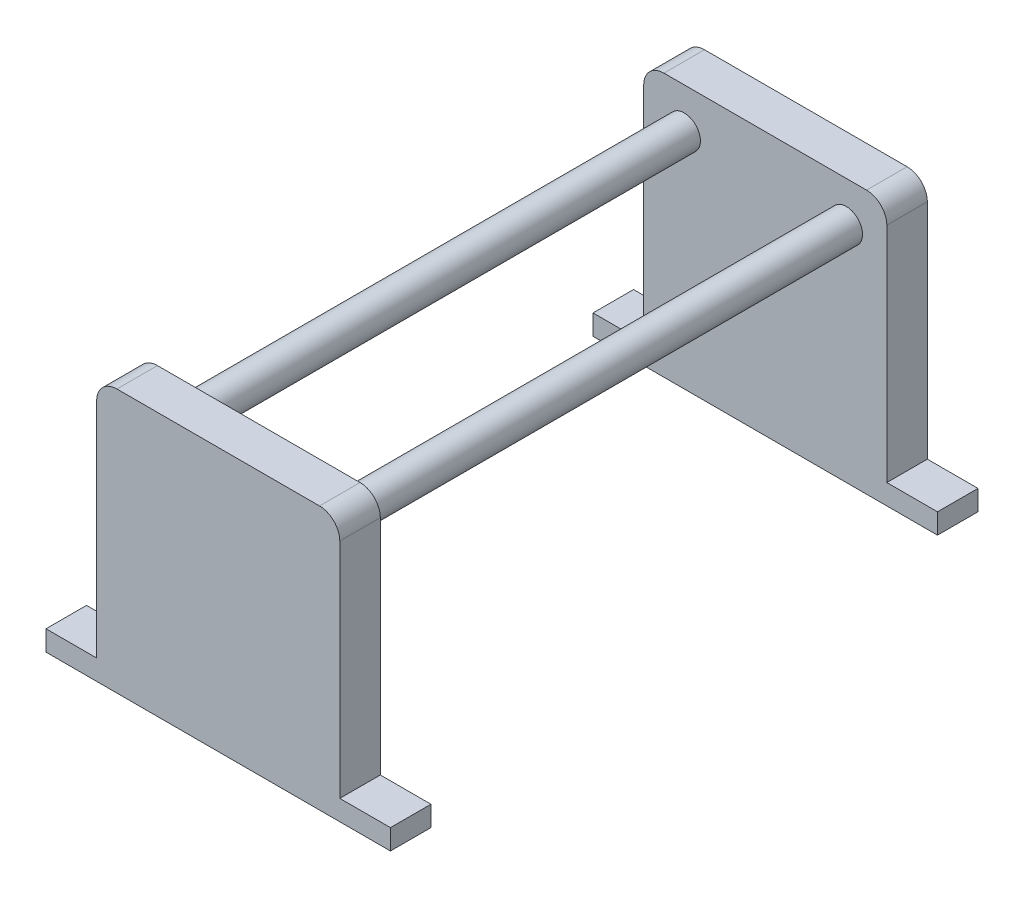
ISO-10303-21;
HEADER;
FILE_DESCRIPTION(('STEP AP214'),'2;1');
FILE_NAME('part.step','',(''),(''),'','','');
FILE_SCHEMA(('AUTOMOTIVE_DESIGN { 1 0 10303 214 1 1 1 1 }'));
ENDSEC;
DATA;
#1=APPLICATION_CONTEXT('core data for automotive mechanical design processes');
#2=APPLICATION_PROTOCOL_DEFINITION('international standard','automotive_design',2000,#1);
#3=PRODUCT_CONTEXT('',#1,'mechanical');
#4=PRODUCT('Part','Part','',(#3));
#5=PRODUCT_RELATED_PRODUCT_CATEGORY('part','',(#4));
#6=PRODUCT_DEFINITION_FORMATION('','',#4);
#7=PRODUCT_DEFINITION_CONTEXT('part definition',#1,'design');
#8=PRODUCT_DEFINITION('design','',#6,#7);
#9=PRODUCT_DEFINITION_SHAPE('','',#8);
#10=(LENGTH_UNIT() NAMED_UNIT(*) SI_UNIT(.MILLI.,.METRE.));
#11=(NAMED_UNIT(*) PLANE_ANGLE_UNIT() SI_UNIT($,.RADIAN.));
#12=(NAMED_UNIT(*) SI_UNIT($,.STERADIAN.) SOLID_ANGLE_UNIT());
#13=UNCERTAINTY_MEASURE_WITH_UNIT(LENGTH_MEASURE(1.E-05),#10,'distance_accuracy_value','');
#14=(GEOMETRIC_REPRESENTATION_CONTEXT(3) GLOBAL_UNCERTAINTY_ASSIGNED_CONTEXT((#13)) GLOBAL_UNIT_ASSIGNED_CONTEXT((#10,
#11,#12)) REPRESENTATION_CONTEXT('',''));
#15=CARTESIAN_POINT('',(0.,0.,0.));
#16=DIRECTION('',(0.,0.,1.));
#17=DIRECTION('',(1.,0.,0.));
#18=AXIS2_PLACEMENT_3D('',#15,#16,#17);
#19=CARTESIAN_POINT('',(0.,30.,10.));
#20=DIRECTION('',(0.,-1.,0.));
#21=DIRECTION('',(0.,0.,-1.));
#22=AXIS2_PLACEMENT_3D('',#19,#20,#21);
#23=PLANE('',#22);
#24=DIRECTION('',(-1.,0.,0.));
#25=VECTOR('',#24,1.);
#26=CARTESIAN_POINT('',(0.,30.,10.));
#27=LINE('',#26,#25);
#28=CARTESIAN_POINT('',(25.,30.,10.));
#29=VERTEX_POINT('',#28);
#30=CARTESIAN_POINT('',(-25.,30.,10.));
#31=VERTEX_POINT('',#30);
#32=EDGE_CURVE('E244',#29,#31,#27,.T.);
#33=ORIENTED_EDGE('',*,*,#32,.F.);
#34=DIRECTION('',(0.,0.,-1.));
#35=VECTOR('',#34,1.);
#36=CARTESIAN_POINT('',(25.,30.,0.));
#37=LINE('',#36,#35);
#38=CARTESIAN_POINT('',(25.,30.,0.));
#39=VERTEX_POINT('',#38);
#40=EDGE_CURVE('E297',#29,#39,#37,.T.);
#41=ORIENTED_EDGE('',*,*,#40,.T.);
#42=DIRECTION('',(-1.,0.,0.));
#43=VECTOR('',#42,1.);
#44=CARTESIAN_POINT('',(0.,30.,0.));
#45=LINE('',#44,#43);
#46=CARTESIAN_POINT('',(-25.,30.,0.));
#47=VERTEX_POINT('',#46);
#48=EDGE_CURVE('E243',#39,#47,#45,.T.);
#49=ORIENTED_EDGE('',*,*,#48,.T.);
#50=DIRECTION('',(0.,0.,-1.));
#51=VECTOR('',#50,1.);
#52=CARTESIAN_POINT('',(-25.,30.,10.));
#53=LINE('',#52,#51);
#54=EDGE_CURVE('E295',#47,#31,#53,.F.);
#55=ORIENTED_EDGE('',*,*,#54,.T.);
#56=EDGE_LOOP('',(#33,#41,#49,#55));
#57=FACE_BOUND('',#56,.T.);
#58=ADVANCED_FACE('F34',(#57),#23,.F.);
#59=CARTESIAN_POINT('',(-30.,0.,10.));
#60=DIRECTION('',(1.,0.,0.));
#61=DIRECTION('',(0.,0.,-1.));
#62=AXIS2_PLACEMENT_3D('',#59,#60,#61);
#63=PLANE('',#62);
#64=DIRECTION('',(0.,-1.,0.));
#65=VECTOR('',#64,1.);
#66=CARTESIAN_POINT('',(-30.,0.,10.));
#67=LINE('',#66,#65);
#68=CARTESIAN_POINT('',(-30.,25.,10.));
#69=VERTEX_POINT('',#68);
#70=CARTESIAN_POINT('',(-30.,-30.,10.));
#71=VERTEX_POINT('',#70);
#72=EDGE_CURVE('E247',#69,#71,#67,.T.);
#73=ORIENTED_EDGE('',*,*,#72,.F.);
#74=DIRECTION('',(0.,0.,-1.));
#75=VECTOR('',#74,1.);
#76=CARTESIAN_POINT('',(-30.,25.,10.));
#77=LINE('',#76,#75);
#78=CARTESIAN_POINT('',(-30.,25.,0.));
#79=VERTEX_POINT('',#78);
#80=EDGE_CURVE('E310',#69,#79,#77,.T.);
#81=ORIENTED_EDGE('',*,*,#80,.T.);
#82=DIRECTION('',(0.,-1.,0.));
#83=VECTOR('',#82,1.);
#84=CARTESIAN_POINT('',(-30.,0.,0.));
#85=LINE('',#84,#83);
#86=CARTESIAN_POINT('',(-30.,-30.,0.));
#87=VERTEX_POINT('',#86);
#88=EDGE_CURVE('E266',#79,#87,#85,.T.);
#89=ORIENTED_EDGE('',*,*,#88,.T.);
#90=DIRECTION('',(0.,0.,-1.));
#91=VECTOR('',#90,1.);
#92=CARTESIAN_POINT('',(-30.,-30.,10.));
#93=LINE('',#92,#91);
#94=EDGE_CURVE('E292',#71,#87,#93,.T.);
#95=ORIENTED_EDGE('',*,*,#94,.F.);
#96=EDGE_LOOP('',(#73,#81,#89,#95));
#97=FACE_BOUND('',#96,.T.);
#98=ADVANCED_FACE('F362',(#97),#63,.F.);
#99=CARTESIAN_POINT('',(0.,-30.,10.));
#100=DIRECTION('',(0.,1.,0.));
#101=DIRECTION('',(-1.,0.,0.));
#102=AXIS2_PLACEMENT_3D('',#99,#100,#101);
#103=PLANE('',#102);
#104=DIRECTION('',(1.,0.,0.));
#105=VECTOR('',#104,1.);
#106=CARTESIAN_POINT('',(0.,-30.,0.));
#107=LINE('',#106,#105);
#108=CARTESIAN_POINT('',(-42.5,-30.,0.));
#109=VERTEX_POINT('',#108);
#110=EDGE_CURVE('E268',#109,#87,#107,.T.);
#111=ORIENTED_EDGE('',*,*,#110,.F.);
#112=DIRECTION('',(0.,0.,-1.));
#113=VECTOR('',#112,1.);
#114=CARTESIAN_POINT('',(-42.5,-30.,10.));
#115=LINE('',#114,#113);
#116=CARTESIAN_POINT('',(-42.5,-30.,10.));
#117=VERTEX_POINT('',#116);
#118=EDGE_CURVE('E290',#117,#109,#115,.T.);
#119=ORIENTED_EDGE('',*,*,#118,.F.);
#120=DIRECTION('',(1.,0.,0.));
#121=VECTOR('',#120,1.);
#122=CARTESIAN_POINT('',(0.,-30.,10.));
#123=LINE('',#122,#121);
#124=EDGE_CURVE('E250',#117,#71,#123,.T.);
#125=ORIENTED_EDGE('',*,*,#124,.T.);
#126=ORIENTED_EDGE('',*,*,#94,.T.);
#127=EDGE_LOOP('',(#111,#119,#125,#126));
#128=FACE_BOUND('',#127,.T.);
#129=ADVANCED_FACE('F368',(#128),#103,.T.);
#130=CARTESIAN_POINT('',(-42.5,0.,10.));
#131=DIRECTION('',(1.,0.,0.));
#132=DIRECTION('',(0.,0.,-1.));
#133=AXIS2_PLACEMENT_3D('',#130,#131,#132);
#134=PLANE('',#133);
#135=DIRECTION('',(0.,-1.,0.));
#136=VECTOR('',#135,1.);
#137=CARTESIAN_POINT('',(-42.5,0.,0.));
#138=LINE('',#137,#136);
#139=CARTESIAN_POINT('',(-42.5,-35.,0.));
#140=VERTEX_POINT('',#139);
#141=EDGE_CURVE('E271',#109,#140,#138,.T.);
#142=ORIENTED_EDGE('',*,*,#141,.T.);
#143=DIRECTION('',(0.,0.,-1.));
#144=VECTOR('',#143,1.);
#145=CARTESIAN_POINT('',(-42.5,-35.,10.));
#146=LINE('',#145,#144);
#147=CARTESIAN_POINT('',(-42.5,-35.,10.));
#148=VERTEX_POINT('',#147);
#149=EDGE_CURVE('E287',#148,#140,#146,.T.);
#150=ORIENTED_EDGE('',*,*,#149,.F.);
#151=DIRECTION('',(0.,-1.,0.));
#152=VECTOR('',#151,1.);
#153=CARTESIAN_POINT('',(-42.5,0.,10.));
#154=LINE('',#153,#152);
#155=EDGE_CURVE('E253',#117,#148,#154,.T.);
#156=ORIENTED_EDGE('',*,*,#155,.F.);
#157=ORIENTED_EDGE('',*,*,#118,.T.);
#158=EDGE_LOOP('',(#142,#150,#156,#157));
#159=FACE_BOUND('',#158,.T.);
#160=ADVANCED_FACE('F407',(#159),#134,.F.);
#161=CARTESIAN_POINT('',(0.,-35.,10.));
#162=DIRECTION('',(0.,1.,0.));
#163=DIRECTION('',(0.,0.,1.));
#164=AXIS2_PLACEMENT_3D('',#161,#162,#163);
#165=PLANE('',#164);
#166=DIRECTION('',(1.,0.,0.));
#167=VECTOR('',#166,1.);
#168=CARTESIAN_POINT('',(0.,-35.,0.));
#169=LINE('',#168,#167);
#170=CARTESIAN_POINT('',(42.5,-35.,0.));
#171=VERTEX_POINT('',#170);
#172=EDGE_CURVE('E274',#140,#171,#169,.T.);
#173=ORIENTED_EDGE('',*,*,#172,.T.);
#174=DIRECTION('',(0.,0.,-1.));
#175=VECTOR('',#174,1.);
#176=CARTESIAN_POINT('',(42.5,-35.,10.));
#177=LINE('',#176,#175);
#178=CARTESIAN_POINT('',(42.5,-35.,10.));
#179=VERTEX_POINT('',#178);
#180=EDGE_CURVE('E285',#179,#171,#177,.T.);
#181=ORIENTED_EDGE('',*,*,#180,.F.);
#182=DIRECTION('',(1.,0.,0.));
#183=VECTOR('',#182,1.);
#184=CARTESIAN_POINT('',(0.,-35.,10.));
#185=LINE('',#184,#183);
#186=EDGE_CURVE('E256',#148,#179,#185,.T.);
#187=ORIENTED_EDGE('',*,*,#186,.F.);
#188=ORIENTED_EDGE('',*,*,#149,.T.);
#189=EDGE_LOOP('',(#173,#181,#187,#188));
#190=FACE_BOUND('',#189,.T.);
#191=ADVANCED_FACE('F411',(#190),#165,.F.);
#192=CARTESIAN_POINT('',(42.5,0.,10.));
#193=DIRECTION('',(1.,0.,0.));
#194=DIRECTION('',(0.,1.,0.));
#195=AXIS2_PLACEMENT_3D('',#192,#193,#194);
#196=PLANE('',#195);
#197=DIRECTION('',(0.,-1.,0.));
#198=VECTOR('',#197,1.);
#199=CARTESIAN_POINT('',(42.5,0.,0.));
#200=LINE('',#199,#198);
#201=CARTESIAN_POINT('',(42.5,-30.,0.));
#202=VERTEX_POINT('',#201);
#203=EDGE_CURVE('E277',#202,#171,#200,.T.);
#204=ORIENTED_EDGE('',*,*,#203,.F.);
#205=DIRECTION('',(0.,0.,-1.));
#206=VECTOR('',#205,1.);
#207=CARTESIAN_POINT('',(42.5,-30.,10.));
#208=LINE('',#207,#206);
#209=CARTESIAN_POINT('',(42.5,-30.,10.));
#210=VERTEX_POINT('',#209);
#211=EDGE_CURVE('E283',#210,#202,#208,.T.);
#212=ORIENTED_EDGE('',*,*,#211,.F.);
#213=DIRECTION('',(0.,-1.,0.));
#214=VECTOR('',#213,1.);
#215=CARTESIAN_POINT('',(42.5,0.,10.));
#216=LINE('',#215,#214);
#217=EDGE_CURVE('E258',#210,#179,#216,.T.);
#218=ORIENTED_EDGE('',*,*,#217,.T.);
#219=ORIENTED_EDGE('',*,*,#180,.T.);
#220=EDGE_LOOP('',(#204,#212,#218,#219));
#221=FACE_BOUND('',#220,.T.);
#222=ADVANCED_FACE('F414',(#221),#196,.T.);
#223=CARTESIAN_POINT('',(30.,-30.,0.));
#224=VERTEX_POINT('',#223);
#225=EDGE_CURVE('E272',#224,#202,#107,.T.);
#226=ORIENTED_EDGE('',*,*,#225,.F.);
#227=DIRECTION('',(0.,0.,-1.));
#228=VECTOR('',#227,1.);
#229=CARTESIAN_POINT('',(30.,-30.,10.));
#230=LINE('',#229,#228);
#231=CARTESIAN_POINT('',(30.,-30.,10.));
#232=VERTEX_POINT('',#231);
#233=EDGE_CURVE('E263',#232,#224,#230,.T.);
#234=ORIENTED_EDGE('',*,*,#233,.F.);
#235=EDGE_CURVE('E254',#232,#210,#123,.T.);
#236=ORIENTED_EDGE('',*,*,#235,.T.);
#237=ORIENTED_EDGE('',*,*,#211,.T.);
#238=EDGE_LOOP('',(#226,#234,#236,#237));
#239=FACE_BOUND('',#238,.T.);
#240=ADVANCED_FACE('F420',(#239),#103,.T.);
#241=CARTESIAN_POINT('',(30.,0.,10.));
#242=DIRECTION('',(1.,0.,0.));
#243=DIRECTION('',(0.,0.,-1.));
#244=AXIS2_PLACEMENT_3D('',#241,#242,#243);
#245=PLANE('',#244);
#246=DIRECTION('',(0.,-1.,0.));
#247=VECTOR('',#246,1.);
#248=CARTESIAN_POINT('',(30.,0.,0.));
#249=LINE('',#248,#247);
#250=CARTESIAN_POINT('',(30.,25.,0.));
#251=VERTEX_POINT('',#250);
#252=EDGE_CURVE('E248',#251,#224,#249,.T.);
#253=ORIENTED_EDGE('',*,*,#252,.F.);
#254=DIRECTION('',(0.,0.,-1.));
#255=VECTOR('',#254,1.);
#256=CARTESIAN_POINT('',(30.,25.,10.));
#257=LINE('',#256,#255);
#258=CARTESIAN_POINT('',(30.,25.,10.));
#259=VERTEX_POINT('',#258);
#260=EDGE_CURVE('E304',#251,#259,#257,.F.);
#261=ORIENTED_EDGE('',*,*,#260,.T.);
#262=DIRECTION('',(0.,-1.,0.));
#263=VECTOR('',#262,1.);
#264=CARTESIAN_POINT('',(30.,0.,10.));
#265=LINE('',#264,#263);
#266=EDGE_CURVE('E261',#259,#232,#265,.T.);
#267=ORIENTED_EDGE('',*,*,#266,.T.);
#268=ORIENTED_EDGE('',*,*,#233,.T.);
#269=EDGE_LOOP('',(#253,#261,#267,#268));
#270=FACE_BOUND('',#269,.T.);
#271=ADVANCED_FACE('F424',(#270),#245,.T.);
#272=CARTESIAN_POINT('',(0.,0.,10.));
#273=DIRECTION('',(0.,0.,1.));
#274=DIRECTION('',(1.,0.,0.));
#275=AXIS2_PLACEMENT_3D('',#272,#273,#274);
#276=PLANE('',#275);
#277=ORIENTED_EDGE('',*,*,#266,.F.);
#278=CARTESIAN_POINT('',(25.,25.,10.));
#279=DIRECTION('',(0.,0.,1.));
#280=DIRECTION('',(1.,0.,0.));
#281=AXIS2_PLACEMENT_3D('',#278,#279,#280);
#282=CIRCLE('',#281,5.);
#283=EDGE_CURVE('E308',#259,#29,#282,.T.);
#284=ORIENTED_EDGE('',*,*,#283,.T.);
#285=ORIENTED_EDGE('',*,*,#32,.T.);
#286=CARTESIAN_POINT('',(-25.,25.,10.));
#287=DIRECTION('',(0.,0.,1.));
#288=DIRECTION('',(1.,0.,0.));
#289=AXIS2_PLACEMENT_3D('',#286,#287,#288);
#290=CIRCLE('',#289,5.);
#291=EDGE_CURVE('E306',#31,#69,#290,.T.);
#292=ORIENTED_EDGE('',*,*,#291,.T.);
#293=ORIENTED_EDGE('',*,*,#72,.T.);
#294=ORIENTED_EDGE('',*,*,#124,.F.);
#295=ORIENTED_EDGE('',*,*,#155,.T.);
#296=ORIENTED_EDGE('',*,*,#186,.T.);
#297=ORIENTED_EDGE('',*,*,#217,.F.);
#298=ORIENTED_EDGE('',*,*,#235,.F.);
#299=EDGE_LOOP('',(#277,#284,#285,#292,#293,#294,#295,#296,#297,#298));
#300=FACE_BOUND('',#299,.T.);
#301=ADVANCED_FACE('F395',(#300),#276,.T.);
#302=CARTESIAN_POINT('',(0.,0.,0.));
#303=DIRECTION('',(0.,0.,1.));
#304=DIRECTION('',(1.,0.,0.));
#305=AXIS2_PLACEMENT_3D('',#302,#303,#304);
#306=PLANE('',#305);
#307=CARTESIAN_POINT('',(-20.,20.,0.));
#308=DIRECTION('',(0.,0.,1.));
#309=DIRECTION('',(1.,0.,0.));
#310=AXIS2_PLACEMENT_3D('',#307,#308,#309);
#311=CIRCLE('',#310,4.);
#312=CARTESIAN_POINT('',(-16.,20.,0.));
#313=VERTEX_POINT('',#312);
#314=EDGE_CURVE('E316',#313,#313,#311,.F.);
#315=ORIENTED_EDGE('',*,*,#314,.F.);
#316=EDGE_LOOP('',(#315));
#317=FACE_BOUND('',#316,.T.);
#318=CARTESIAN_POINT('',(20.,20.,0.));
#319=DIRECTION('',(0.,0.,1.));
#320=DIRECTION('',(1.,0.,0.));
#321=AXIS2_PLACEMENT_3D('',#318,#319,#320);
#322=CIRCLE('',#321,4.);
#323=CARTESIAN_POINT('',(24.,20.,0.));
#324=VERTEX_POINT('',#323);
#325=EDGE_CURVE('E313',#324,#324,#322,.F.);
#326=ORIENTED_EDGE('',*,*,#325,.F.);
#327=EDGE_LOOP('',(#326));
#328=FACE_BOUND('',#327,.T.);
#329=ORIENTED_EDGE('',*,*,#48,.F.);
#330=CARTESIAN_POINT('',(25.,25.,0.));
#331=DIRECTION('',(0.,0.,1.));
#332=DIRECTION('',(1.,0.,0.));
#333=AXIS2_PLACEMENT_3D('',#330,#331,#332);
#334=CIRCLE('',#333,5.);
#335=EDGE_CURVE('E302',#39,#251,#334,.F.);
#336=ORIENTED_EDGE('',*,*,#335,.T.);
#337=ORIENTED_EDGE('',*,*,#252,.T.);
#338=ORIENTED_EDGE('',*,*,#225,.T.);
#339=ORIENTED_EDGE('',*,*,#203,.T.);
#340=ORIENTED_EDGE('',*,*,#172,.F.);
#341=ORIENTED_EDGE('',*,*,#141,.F.);
#342=ORIENTED_EDGE('',*,*,#110,.T.);
#343=ORIENTED_EDGE('',*,*,#88,.F.);
#344=CARTESIAN_POINT('',(-25.,25.,0.));
#345=DIRECTION('',(0.,0.,1.));
#346=DIRECTION('',(1.,0.,0.));
#347=AXIS2_PLACEMENT_3D('',#344,#345,#346);
#348=CIRCLE('',#347,5.);
#349=EDGE_CURVE('E300',#79,#47,#348,.F.);
#350=ORIENTED_EDGE('',*,*,#349,.T.);
#351=EDGE_LOOP('',(#329,#336,#337,#338,#339,#340,#341,#342,#343,#350));
#352=FACE_BOUND('',#351,.T.);
#353=ADVANCED_FACE('F378',(#317,#328,#352),#306,.F.);
#354=CARTESIAN_POINT('',(25.,25.,10.));
#355=DIRECTION('',(0.,0.,1.));
#356=DIRECTION('',(1.,0.,0.));
#357=AXIS2_PLACEMENT_3D('',#354,#355,#356);
#358=CYLINDRICAL_SURFACE('',#357,5.);
#359=ORIENTED_EDGE('',*,*,#283,.F.);
#360=ORIENTED_EDGE('',*,*,#260,.F.);
#361=ORIENTED_EDGE('',*,*,#335,.F.);
#362=ORIENTED_EDGE('',*,*,#40,.F.);
#363=EDGE_LOOP('',(#359,#360,#361,#362));
#364=FACE_BOUND('',#363,.T.);
#365=ADVANCED_FACE('F374',(#364),#358,.T.);
#366=CARTESIAN_POINT('',(-25.,25.,10.));
#367=DIRECTION('',(0.,0.,-1.));
#368=DIRECTION('',(-1.,0.,0.));
#369=AXIS2_PLACEMENT_3D('',#366,#367,#368);
#370=CYLINDRICAL_SURFACE('',#369,5.);
#371=ORIENTED_EDGE('',*,*,#291,.F.);
#372=ORIENTED_EDGE('',*,*,#54,.F.);
#373=ORIENTED_EDGE('',*,*,#349,.F.);
#374=ORIENTED_EDGE('',*,*,#80,.F.);
#375=EDGE_LOOP('',(#371,#372,#373,#374));
#376=FACE_BOUND('',#375,.T.);
#377=ADVANCED_FACE('F377',(#376),#370,.T.);
#378=CARTESIAN_POINT('',(20.,20.,-125.));
#379=DIRECTION('',(0.,0.,1.));
#380=DIRECTION('',(1.,0.,0.));
#381=AXIS2_PLACEMENT_3D('',#378,#379,#380);
#382=CYLINDRICAL_SURFACE('',#381,4.);
#383=CARTESIAN_POINT('',(20.,20.,-125.));
#384=DIRECTION('',(0.,0.,-1.));
#385=DIRECTION('',(-1.,0.,0.));
#386=AXIS2_PLACEMENT_3D('',#383,#384,#385);
#387=CIRCLE('',#386,4.);
#388=CARTESIAN_POINT('',(16.,20.,-125.));
#389=VERTEX_POINT('',#388);
#390=EDGE_CURVE('E240',#389,#389,#387,.T.);
#391=ORIENTED_EDGE('',*,*,#390,.F.);
#392=EDGE_LOOP('',(#391));
#393=FACE_BOUND('',#392,.T.);
#394=ORIENTED_EDGE('',*,*,#325,.T.);
#395=EDGE_LOOP('',(#394));
#396=FACE_BOUND('',#395,.T.);
#397=ADVANCED_FACE('F381',(#393,#396),#382,.T.);
#398=CARTESIAN_POINT('',(-20.,20.,-125.));
#399=DIRECTION('',(0.,0.,1.));
#400=DIRECTION('',(1.,0.,0.));
#401=AXIS2_PLACEMENT_3D('',#398,#399,#400);
#402=CYLINDRICAL_SURFACE('',#401,4.);
#403=CARTESIAN_POINT('',(-20.,20.,-125.));
#404=DIRECTION('',(0.,0.,-1.));
#405=DIRECTION('',(1.,0.,0.));
#406=AXIS2_PLACEMENT_3D('',#403,#404,#405);
#407=CIRCLE('',#406,4.);
#408=CARTESIAN_POINT('',(-16.,20.,-125.));
#409=VERTEX_POINT('',#408);
#410=EDGE_CURVE('E188',#409,#409,#407,.T.);
#411=ORIENTED_EDGE('',*,*,#410,.F.);
#412=EDGE_LOOP('',(#411));
#413=FACE_BOUND('',#412,.T.);
#414=ORIENTED_EDGE('',*,*,#314,.T.);
#415=EDGE_LOOP('',(#414));
#416=FACE_BOUND('',#415,.T.);
#417=ADVANCED_FACE('F386',(#413,#416),#402,.T.);
#418=CARTESIAN_POINT('',(-30.,0.,-135.));
#419=DIRECTION('',(-1.,0.,0.));
#420=DIRECTION('',(0.,0.,1.));
#421=AXIS2_PLACEMENT_3D('',#418,#419,#420);
#422=PLANE('',#421);
#423=DIRECTION('',(0.,-1.,0.));
#424=VECTOR('',#423,1.);
#425=CARTESIAN_POINT('',(-30.,0.,-125.));
#426=LINE('',#425,#424);
#427=CARTESIAN_POINT('',(-30.,25.,-125.));
#428=VERTEX_POINT('',#427);
#429=CARTESIAN_POINT('',(-30.,-30.,-125.));
#430=VERTEX_POINT('',#429);
#431=EDGE_CURVE('E214',#428,#430,#426,.T.);
#432=ORIENTED_EDGE('',*,*,#431,.F.);
#433=DIRECTION('',(0.,0.,1.));
#434=VECTOR('',#433,1.);
#435=CARTESIAN_POINT('',(-30.,25.,-135.));
#436=LINE('',#435,#434);
#437=CARTESIAN_POINT('',(-30.,25.,-135.));
#438=VERTEX_POINT('',#437);
#439=EDGE_CURVE('E11',#428,#438,#436,.F.);
#440=ORIENTED_EDGE('',*,*,#439,.T.);
#441=DIRECTION('',(0.,-1.,0.));
#442=VECTOR('',#441,1.);
#443=CARTESIAN_POINT('',(-30.,0.,-135.));
#444=LINE('',#443,#442);
#445=CARTESIAN_POINT('',(-30.,-30.,-135.));
#446=VERTEX_POINT('',#445);
#447=EDGE_CURVE('E336',#438,#446,#444,.T.);
#448=ORIENTED_EDGE('',*,*,#447,.T.);
#449=DIRECTION('',(0.,0.,1.));
#450=VECTOR('',#449,1.);
#451=CARTESIAN_POINT('',(-30.,-30.,-135.));
#452=LINE('',#451,#450);
#453=EDGE_CURVE('E200',#446,#430,#452,.T.);
#454=ORIENTED_EDGE('',*,*,#453,.T.);
#455=EDGE_LOOP('',(#432,#440,#448,#454));
#456=FACE_BOUND('',#455,.T.);
#457=ADVANCED_FACE('F355',(#456),#422,.T.);
#458=CARTESIAN_POINT('',(0.,30.,-135.));
#459=DIRECTION('',(0.,1.,0.));
#460=DIRECTION('',(0.,0.,1.));
#461=AXIS2_PLACEMENT_3D('',#458,#459,#460);
#462=PLANE('',#461);
#463=DIRECTION('',(-1.,0.,0.));
#464=VECTOR('',#463,1.);
#465=CARTESIAN_POINT('',(0.,30.,-125.));
#466=LINE('',#465,#464);
#467=CARTESIAN_POINT('',(25.,30.,-125.));
#468=VERTEX_POINT('',#467);
#469=CARTESIAN_POINT('',(-25.,30.,-125.));
#470=VERTEX_POINT('',#469);
#471=EDGE_CURVE('E216',#468,#470,#466,.T.);
#472=ORIENTED_EDGE('',*,*,#471,.F.);
#473=DIRECTION('',(0.,0.,1.));
#474=VECTOR('',#473,1.);
#475=CARTESIAN_POINT('',(25.,30.,-135.));
#476=LINE('',#475,#474);
#477=CARTESIAN_POINT('',(25.,30.,-135.));
#478=VERTEX_POINT('',#477);
#479=EDGE_CURVE('E328',#468,#478,#476,.F.);
#480=ORIENTED_EDGE('',*,*,#479,.T.);
#481=DIRECTION('',(-1.,0.,0.));
#482=VECTOR('',#481,1.);
#483=CARTESIAN_POINT('',(0.,30.,-135.));
#484=LINE('',#483,#482);
#485=CARTESIAN_POINT('',(-25.,30.,-135.));
#486=VERTEX_POINT('',#485);
#487=EDGE_CURVE('E179',#478,#486,#484,.T.);
#488=ORIENTED_EDGE('',*,*,#487,.T.);
#489=DIRECTION('',(0.,0.,1.));
#490=VECTOR('',#489,1.);
#491=CARTESIAN_POINT('',(-25.,30.,-135.));
#492=LINE('',#491,#490);
#493=EDGE_CURVE('E325',#486,#470,#492,.T.);
#494=ORIENTED_EDGE('',*,*,#493,.T.);
#495=EDGE_LOOP('',(#472,#480,#488,#494));
#496=FACE_BOUND('',#495,.T.);
#497=ADVANCED_FACE('F333',(#496),#462,.T.);
#498=CARTESIAN_POINT('',(30.,0.,-135.));
#499=DIRECTION('',(-1.,0.,0.));
#500=DIRECTION('',(0.,0.,1.));
#501=AXIS2_PLACEMENT_3D('',#498,#499,#500);
#502=PLANE('',#501);
#503=DIRECTION('',(0.,-1.,0.));
#504=VECTOR('',#503,1.);
#505=CARTESIAN_POINT('',(30.,0.,-135.));
#506=LINE('',#505,#504);
#507=CARTESIAN_POINT('',(30.,25.,-135.));
#508=VERTEX_POINT('',#507);
#509=CARTESIAN_POINT('',(30.,-30.,-135.));
#510=VERTEX_POINT('',#509);
#511=EDGE_CURVE('E169',#508,#510,#506,.T.);
#512=ORIENTED_EDGE('',*,*,#511,.F.);
#513=DIRECTION('',(0.,0.,1.));
#514=VECTOR('',#513,1.);
#515=CARTESIAN_POINT('',(30.,25.,-125.));
#516=LINE('',#515,#514);
#517=CARTESIAN_POINT('',(30.,25.,-125.));
#518=VERTEX_POINT('',#517);
#519=EDGE_CURVE('E319',#508,#518,#516,.T.);
#520=ORIENTED_EDGE('',*,*,#519,.T.);
#521=DIRECTION('',(0.,-1.,0.));
#522=VECTOR('',#521,1.);
#523=CARTESIAN_POINT('',(30.,0.,-125.));
#524=LINE('',#523,#522);
#525=CARTESIAN_POINT('',(30.,-30.,-125.));
#526=VERTEX_POINT('',#525);
#527=EDGE_CURVE('E185',#518,#526,#524,.T.);
#528=ORIENTED_EDGE('',*,*,#527,.T.);
#529=DIRECTION('',(0.,0.,1.));
#530=VECTOR('',#529,1.);
#531=CARTESIAN_POINT('',(30.,-30.,-135.));
#532=LINE('',#531,#530);
#533=EDGE_CURVE('E182',#510,#526,#532,.T.);
#534=ORIENTED_EDGE('',*,*,#533,.F.);
#535=EDGE_LOOP('',(#512,#520,#528,#534));
#536=FACE_BOUND('',#535,.T.);
#537=ADVANCED_FACE('F183',(#536),#502,.F.);
#538=CARTESIAN_POINT('',(0.,-30.,-135.));
#539=DIRECTION('',(0.,-1.,0.));
#540=DIRECTION('',(0.,0.,-1.));
#541=AXIS2_PLACEMENT_3D('',#538,#539,#540);
#542=PLANE('',#541);
#543=DIRECTION('',(1.,0.,0.));
#544=VECTOR('',#543,1.);
#545=CARTESIAN_POINT('',(0.,-30.,-125.));
#546=LINE('',#545,#544);
#547=CARTESIAN_POINT('',(42.5,-30.,-125.));
#548=VERTEX_POINT('',#547);
#549=EDGE_CURVE('E220',#526,#548,#546,.T.);
#550=ORIENTED_EDGE('',*,*,#549,.T.);
#551=DIRECTION('',(0.,0.,1.));
#552=VECTOR('',#551,1.);
#553=CARTESIAN_POINT('',(42.5,-30.,-135.));
#554=LINE('',#553,#552);
#555=CARTESIAN_POINT('',(42.5,-30.,-135.));
#556=VERTEX_POINT('',#555);
#557=EDGE_CURVE('E189',#556,#548,#554,.T.);
#558=ORIENTED_EDGE('',*,*,#557,.F.);
#559=DIRECTION('',(1.,0.,0.));
#560=VECTOR('',#559,1.);
#561=CARTESIAN_POINT('',(0.,-30.,-135.));
#562=LINE('',#561,#560);
#563=EDGE_CURVE('E173',#510,#556,#562,.T.);
#564=ORIENTED_EDGE('',*,*,#563,.F.);
#565=ORIENTED_EDGE('',*,*,#533,.T.);
#566=EDGE_LOOP('',(#550,#558,#564,#565));
#567=FACE_BOUND('',#566,.T.);
#568=ADVANCED_FACE('F191',(#567),#542,.F.);
#569=CARTESIAN_POINT('',(42.5,0.,-135.));
#570=DIRECTION('',(-1.,0.,0.));
#571=DIRECTION('',(0.,0.,1.));
#572=AXIS2_PLACEMENT_3D('',#569,#570,#571);
#573=PLANE('',#572);
#574=DIRECTION('',(0.,-1.,0.));
#575=VECTOR('',#574,1.);
#576=CARTESIAN_POINT('',(42.5,0.,-125.));
#577=LINE('',#576,#575);
#578=CARTESIAN_POINT('',(42.5,-35.,-125.));
#579=VERTEX_POINT('',#578);
#580=EDGE_CURVE('E222',#548,#579,#577,.T.);
#581=ORIENTED_EDGE('',*,*,#580,.T.);
#582=DIRECTION('',(0.,0.,1.));
#583=VECTOR('',#582,1.);
#584=CARTESIAN_POINT('',(42.5,-35.,-135.));
#585=LINE('',#584,#583);
#586=CARTESIAN_POINT('',(42.5,-35.,-135.));
#587=VERTEX_POINT('',#586);
#588=EDGE_CURVE('E235',#587,#579,#585,.T.);
#589=ORIENTED_EDGE('',*,*,#588,.F.);
#590=DIRECTION('',(0.,-1.,0.));
#591=VECTOR('',#590,1.);
#592=CARTESIAN_POINT('',(42.5,0.,-135.));
#593=LINE('',#592,#591);
#594=EDGE_CURVE('E194',#556,#587,#593,.T.);
#595=ORIENTED_EDGE('',*,*,#594,.F.);
#596=ORIENTED_EDGE('',*,*,#557,.T.);
#597=EDGE_LOOP('',(#581,#589,#595,#596));
#598=FACE_BOUND('',#597,.T.);
#599=ADVANCED_FACE('F343',(#598),#573,.F.);
#600=CARTESIAN_POINT('',(0.,-35.,-135.));
#601=DIRECTION('',(0.,-1.,0.));
#602=DIRECTION('',(0.,0.,-1.));
#603=AXIS2_PLACEMENT_3D('',#600,#601,#602);
#604=PLANE('',#603);
#605=DIRECTION('',(1.,0.,0.));
#606=VECTOR('',#605,1.);
#607=CARTESIAN_POINT('',(0.,-35.,-125.));
#608=LINE('',#607,#606);
#609=CARTESIAN_POINT('',(-42.5,-35.,-125.));
#610=VERTEX_POINT('',#609);
#611=EDGE_CURVE('E226',#610,#579,#608,.T.);
#612=ORIENTED_EDGE('',*,*,#611,.F.);
#613=DIRECTION('',(0.,0.,1.));
#614=VECTOR('',#613,1.);
#615=CARTESIAN_POINT('',(-42.5,-35.,-135.));
#616=LINE('',#615,#614);
#617=CARTESIAN_POINT('',(-42.5,-35.,-135.));
#618=VERTEX_POINT('',#617);
#619=EDGE_CURVE('E233',#618,#610,#616,.T.);
#620=ORIENTED_EDGE('',*,*,#619,.F.);
#621=DIRECTION('',(1.,0.,0.));
#622=VECTOR('',#621,1.);
#623=CARTESIAN_POINT('',(0.,-35.,-135.));
#624=LINE('',#623,#622);
#625=EDGE_CURVE('E197',#618,#587,#624,.T.);
#626=ORIENTED_EDGE('',*,*,#625,.T.);
#627=ORIENTED_EDGE('',*,*,#588,.T.);
#628=EDGE_LOOP('',(#612,#620,#626,#627));
#629=FACE_BOUND('',#628,.T.);
#630=ADVANCED_FACE('F348',(#629),#604,.T.);
#631=CARTESIAN_POINT('',(-42.5,0.,-135.));
#632=DIRECTION('',(-1.,0.,0.));
#633=DIRECTION('',(0.,0.,1.));
#634=AXIS2_PLACEMENT_3D('',#631,#632,#633);
#635=PLANE('',#634);
#636=DIRECTION('',(0.,-1.,0.));
#637=VECTOR('',#636,1.);
#638=CARTESIAN_POINT('',(-42.5,0.,-125.));
#639=LINE('',#638,#637);
#640=CARTESIAN_POINT('',(-42.5,-30.,-125.));
#641=VERTEX_POINT('',#640);
#642=EDGE_CURVE('E229',#641,#610,#639,.T.);
#643=ORIENTED_EDGE('',*,*,#642,.F.);
#644=DIRECTION('',(0.,0.,1.));
#645=VECTOR('',#644,1.);
#646=CARTESIAN_POINT('',(-42.5,-30.,-135.));
#647=LINE('',#646,#645);
#648=CARTESIAN_POINT('',(-42.5,-30.,-135.));
#649=VERTEX_POINT('',#648);
#650=EDGE_CURVE('E206',#649,#641,#647,.T.);
#651=ORIENTED_EDGE('',*,*,#650,.F.);
#652=DIRECTION('',(0.,-1.,0.));
#653=VECTOR('',#652,1.);
#654=CARTESIAN_POINT('',(-42.5,0.,-135.));
#655=LINE('',#654,#653);
#656=EDGE_CURVE('E201',#649,#618,#655,.T.);
#657=ORIENTED_EDGE('',*,*,#656,.T.);
#658=ORIENTED_EDGE('',*,*,#619,.T.);
#659=EDGE_LOOP('',(#643,#651,#657,#658));
#660=FACE_BOUND('',#659,.T.);
#661=ADVANCED_FACE('F350',(#660),#635,.T.);
#662=EDGE_CURVE('E223',#641,#430,#546,.T.);
#663=ORIENTED_EDGE('',*,*,#662,.T.);
#664=ORIENTED_EDGE('',*,*,#453,.F.);
#665=EDGE_CURVE('E196',#649,#446,#562,.T.);
#666=ORIENTED_EDGE('',*,*,#665,.F.);
#667=ORIENTED_EDGE('',*,*,#650,.T.);
#668=EDGE_LOOP('',(#663,#664,#666,#667));
#669=FACE_BOUND('',#668,.T.);
#670=ADVANCED_FACE('F517',(#669),#542,.F.);
#671=CARTESIAN_POINT('',(0.,0.,-135.));
#672=DIRECTION('',(0.,0.,-1.));
#673=DIRECTION('',(-1.,0.,0.));
#674=AXIS2_PLACEMENT_3D('',#671,#672,#673);
#675=PLANE('',#674);
#676=ORIENTED_EDGE('',*,*,#487,.F.);
#677=CARTESIAN_POINT('',(25.,25.,-135.));
#678=DIRECTION('',(0.,0.,-1.));
#679=DIRECTION('',(-1.,0.,0.));
#680=AXIS2_PLACEMENT_3D('',#677,#678,#679);
#681=CIRCLE('',#680,5.);
#682=EDGE_CURVE('E42',#478,#508,#681,.T.);
#683=ORIENTED_EDGE('',*,*,#682,.T.);
#684=ORIENTED_EDGE('',*,*,#511,.T.);
#685=ORIENTED_EDGE('',*,*,#563,.T.);
#686=ORIENTED_EDGE('',*,*,#594,.T.);
#687=ORIENTED_EDGE('',*,*,#625,.F.);
#688=ORIENTED_EDGE('',*,*,#656,.F.);
#689=ORIENTED_EDGE('',*,*,#665,.T.);
#690=ORIENTED_EDGE('',*,*,#447,.F.);
#691=CARTESIAN_POINT('',(-25.,25.,-135.));
#692=DIRECTION('',(0.,0.,-1.));
#693=DIRECTION('',(-1.,0.,0.));
#694=AXIS2_PLACEMENT_3D('',#691,#692,#693);
#695=CIRCLE('',#694,5.);
#696=EDGE_CURVE('E54',#438,#486,#695,.T.);
#697=ORIENTED_EDGE('',*,*,#696,.T.);
#698=EDGE_LOOP('',(#676,#683,#684,#685,#686,#687,#688,#689,#690,#697));
#699=FACE_BOUND('',#698,.T.);
#700=ADVANCED_FACE('F171',(#699),#675,.T.);
#701=CARTESIAN_POINT('',(0.,0.,-125.));
#702=DIRECTION('',(0.,0.,-1.));
#703=DIRECTION('',(-1.,0.,0.));
#704=AXIS2_PLACEMENT_3D('',#701,#702,#703);
#705=PLANE('',#704);
#706=ORIENTED_EDGE('',*,*,#390,.T.);
#707=EDGE_LOOP('',(#706));
#708=FACE_BOUND('',#707,.T.);
#709=ORIENTED_EDGE('',*,*,#410,.T.);
#710=EDGE_LOOP('',(#709));
#711=FACE_BOUND('',#710,.T.);
#712=ORIENTED_EDGE('',*,*,#527,.F.);
#713=CARTESIAN_POINT('',(25.,25.,-125.));
#714=DIRECTION('',(0.,0.,-1.));
#715=DIRECTION('',(-1.,0.,0.));
#716=AXIS2_PLACEMENT_3D('',#713,#714,#715);
#717=CIRCLE('',#716,5.);
#718=EDGE_CURVE('E323',#518,#468,#717,.F.);
#719=ORIENTED_EDGE('',*,*,#718,.T.);
#720=ORIENTED_EDGE('',*,*,#471,.T.);
#721=CARTESIAN_POINT('',(-25.,25.,-125.));
#722=DIRECTION('',(0.,0.,-1.));
#723=DIRECTION('',(-1.,0.,0.));
#724=AXIS2_PLACEMENT_3D('',#721,#722,#723);
#725=CIRCLE('',#724,5.);
#726=EDGE_CURVE('E321',#470,#428,#725,.F.);
#727=ORIENTED_EDGE('',*,*,#726,.T.);
#728=ORIENTED_EDGE('',*,*,#431,.T.);
#729=ORIENTED_EDGE('',*,*,#662,.F.);
#730=ORIENTED_EDGE('',*,*,#642,.T.);
#731=ORIENTED_EDGE('',*,*,#611,.T.);
#732=ORIENTED_EDGE('',*,*,#580,.F.);
#733=ORIENTED_EDGE('',*,*,#549,.F.);
#734=EDGE_LOOP('',(#712,#719,#720,#727,#728,#729,#730,#731,#732,#733));
#735=FACE_BOUND('',#734,.T.);
#736=ADVANCED_FACE('F340',(#708,#711,#735),#705,.F.);
#737=CARTESIAN_POINT('',(25.,25.,-135.));
#738=DIRECTION('',(0.,0.,-1.));
#739=DIRECTION('',(-1.,0.,0.));
#740=AXIS2_PLACEMENT_3D('',#737,#738,#739);
#741=CYLINDRICAL_SURFACE('',#740,5.);
#742=ORIENTED_EDGE('',*,*,#682,.F.);
#743=ORIENTED_EDGE('',*,*,#479,.F.);
#744=ORIENTED_EDGE('',*,*,#718,.F.);
#745=ORIENTED_EDGE('',*,*,#519,.F.);
#746=EDGE_LOOP('',(#742,#743,#744,#745));
#747=FACE_BOUND('',#746,.T.);
#748=ADVANCED_FACE('F338',(#747),#741,.T.);
#749=CARTESIAN_POINT('',(-25.,25.,-135.));
#750=DIRECTION('',(0.,0.,1.));
#751=DIRECTION('',(1.,0.,0.));
#752=AXIS2_PLACEMENT_3D('',#749,#750,#751);
#753=CYLINDRICAL_SURFACE('',#752,5.);
#754=ORIENTED_EDGE('',*,*,#696,.F.);
#755=ORIENTED_EDGE('',*,*,#439,.F.);
#756=ORIENTED_EDGE('',*,*,#726,.F.);
#757=ORIENTED_EDGE('',*,*,#493,.F.);
#758=EDGE_LOOP('',(#754,#755,#756,#757));
#759=FACE_BOUND('',#758,.T.);
#760=ADVANCED_FACE('F36',(#759),#753,.T.);
#761=CLOSED_SHELL('',(#58,#98,#129,#160,#191,#222,#240,#271,#301,#353,#365,#377,#397,#417,#457,
#497,#537,#568,#599,#630,#661,#670,#700,#736,#748,#760));
#762=MANIFOLD_SOLID_BREP('B2',#761);
#763=ADVANCED_BREP_SHAPE_REPRESENTATION('',(#18,#762),#14);
#764=SHAPE_DEFINITION_REPRESENTATION(#9,#763);
ENDSEC;
END-ISO-10303-21;
